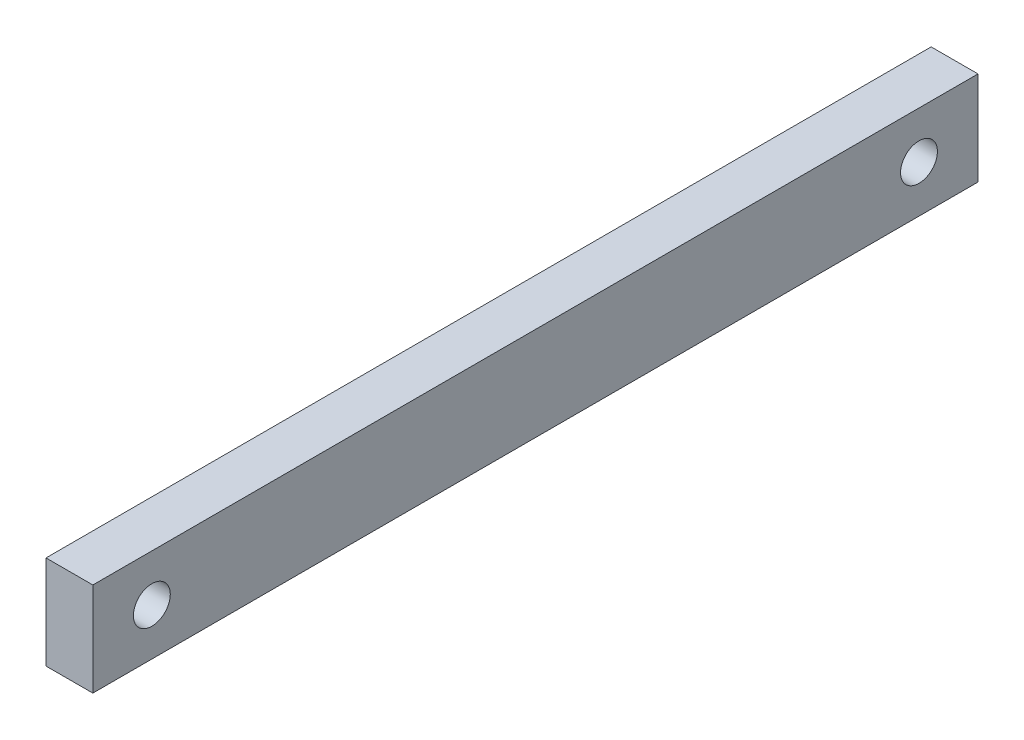
ISO-10303-21;
HEADER;
FILE_DESCRIPTION(('STEP AP214'),'2;1');
FILE_NAME('part.step','',(''),(''),'','','');
FILE_SCHEMA(('AUTOMOTIVE_DESIGN { 1 0 10303 214 1 1 1 1 }'));
ENDSEC;
DATA;
#1=APPLICATION_CONTEXT('core data for automotive mechanical design processes');
#2=APPLICATION_PROTOCOL_DEFINITION('international standard','automotive_design',2000,#1);
#3=PRODUCT_CONTEXT('',#1,'mechanical');
#4=PRODUCT('Part','Part','',(#3));
#5=PRODUCT_RELATED_PRODUCT_CATEGORY('part','',(#4));
#6=PRODUCT_DEFINITION_FORMATION('','',#4);
#7=PRODUCT_DEFINITION_CONTEXT('part definition',#1,'design');
#8=PRODUCT_DEFINITION('design','',#6,#7);
#9=PRODUCT_DEFINITION_SHAPE('','',#8);
#10=(LENGTH_UNIT() NAMED_UNIT(*) SI_UNIT(.MILLI.,.METRE.));
#11=(NAMED_UNIT(*) PLANE_ANGLE_UNIT() SI_UNIT($,.RADIAN.));
#12=(NAMED_UNIT(*) SI_UNIT($,.STERADIAN.) SOLID_ANGLE_UNIT());
#13=UNCERTAINTY_MEASURE_WITH_UNIT(LENGTH_MEASURE(1.E-05),#10,'distance_accuracy_value','');
#14=(GEOMETRIC_REPRESENTATION_CONTEXT(3) GLOBAL_UNCERTAINTY_ASSIGNED_CONTEXT((#13)) GLOBAL_UNIT_ASSIGNED_CONTEXT((#10,
#11,#12)) REPRESENTATION_CONTEXT('',''));
#15=CARTESIAN_POINT('',(0.,0.,0.));
#16=DIRECTION('',(0.,0.,1.));
#17=DIRECTION('',(1.,0.,0.));
#18=AXIS2_PLACEMENT_3D('',#15,#16,#17);
#19=CARTESIAN_POINT('',(3.175,-6.35,-60.));
#20=DIRECTION('',(1.,0.,0.));
#21=DIRECTION('',(0.,0.,-1.));
#22=AXIS2_PLACEMENT_3D('',#19,#20,#21);
#23=PLANE('',#22);
#24=CARTESIAN_POINT('',(3.175,0.,52.));
#25=DIRECTION('',(1.,0.,0.));
#26=DIRECTION('',(0.,0.,-1.));
#27=AXIS2_PLACEMENT_3D('',#24,#25,#26);
#28=CIRCLE('',#27,2.49999999999999);
#29=CARTESIAN_POINT('',(3.175,0.,49.5));
#30=VERTEX_POINT('',#29);
#31=EDGE_CURVE('E105',#30,#30,#28,.T.);
#32=ORIENTED_EDGE('',*,*,#31,.F.);
#33=EDGE_LOOP('',(#32));
#34=FACE_BOUND('',#33,.T.);
#35=CARTESIAN_POINT('',(3.175,0.,-52.));
#36=DIRECTION('',(1.,0.,0.));
#37=DIRECTION('',(0.,0.,1.));
#38=AXIS2_PLACEMENT_3D('',#35,#36,#37);
#39=CIRCLE('',#38,2.49999999999999);
#40=CARTESIAN_POINT('',(3.175,0.,-49.5));
#41=VERTEX_POINT('',#40);
#42=EDGE_CURVE('E108',#41,#41,#39,.T.);
#43=ORIENTED_EDGE('',*,*,#42,.F.);
#44=EDGE_LOOP('',(#43));
#45=FACE_BOUND('',#44,.T.);
#46=DIRECTION('',(0.,0.,1.));
#47=VECTOR('',#46,1.);
#48=CARTESIAN_POINT('',(3.175,6.35,-60.));
#49=LINE('',#48,#47);
#50=CARTESIAN_POINT('',(3.175,6.35,-60.));
#51=VERTEX_POINT('',#50);
#52=CARTESIAN_POINT('',(3.175,6.35,60.));
#53=VERTEX_POINT('',#52);
#54=EDGE_CURVE('E42',#51,#53,#49,.T.);
#55=ORIENTED_EDGE('',*,*,#54,.T.);
#56=DIRECTION('',(0.,1.,0.));
#57=VECTOR('',#56,1.);
#58=CARTESIAN_POINT('',(3.175,-6.35,60.));
#59=LINE('',#58,#57);
#60=CARTESIAN_POINT('',(3.175,-6.35,60.));
#61=VERTEX_POINT('',#60);
#62=EDGE_CURVE('E80',#61,#53,#59,.T.);
#63=ORIENTED_EDGE('',*,*,#62,.F.);
#64=DIRECTION('',(0.,0.,1.));
#65=VECTOR('',#64,1.);
#66=CARTESIAN_POINT('',(3.175,-6.35,-60.));
#67=LINE('',#66,#65);
#68=CARTESIAN_POINT('',(3.175,-6.35,-60.));
#69=VERTEX_POINT('',#68);
#70=EDGE_CURVE('E11',#69,#61,#67,.T.);
#71=ORIENTED_EDGE('',*,*,#70,.F.);
#72=DIRECTION('',(0.,1.,0.));
#73=VECTOR('',#72,1.);
#74=CARTESIAN_POINT('',(3.175,-6.35,-60.));
#75=LINE('',#74,#73);
#76=EDGE_CURVE('E81',#69,#51,#75,.T.);
#77=ORIENTED_EDGE('',*,*,#76,.T.);
#78=EDGE_LOOP('',(#55,#63,#71,#77));
#79=FACE_BOUND('',#78,.T.);
#80=ADVANCED_FACE('F39',(#34,#45,#79),#23,.T.);
#81=CARTESIAN_POINT('',(-3.175,-6.35,-60.));
#82=DIRECTION('',(0.,-1.,0.));
#83=DIRECTION('',(0.,0.,-1.));
#84=AXIS2_PLACEMENT_3D('',#81,#82,#83);
#85=PLANE('',#84);
#86=ORIENTED_EDGE('',*,*,#70,.T.);
#87=DIRECTION('',(1.,0.,0.));
#88=VECTOR('',#87,1.);
#89=CARTESIAN_POINT('',(-3.175,-6.35,60.));
#90=LINE('',#89,#88);
#91=CARTESIAN_POINT('',(-3.175,-6.35,60.));
#92=VERTEX_POINT('',#91);
#93=EDGE_CURVE('E99',#92,#61,#90,.T.);
#94=ORIENTED_EDGE('',*,*,#93,.F.);
#95=DIRECTION('',(0.,0.,1.));
#96=VECTOR('',#95,1.);
#97=CARTESIAN_POINT('',(-3.175,-6.35,-60.));
#98=LINE('',#97,#96);
#99=CARTESIAN_POINT('',(-3.175,-6.35,-60.));
#100=VERTEX_POINT('',#99);
#101=EDGE_CURVE('E48',#100,#92,#98,.T.);
#102=ORIENTED_EDGE('',*,*,#101,.F.);
#103=DIRECTION('',(1.,0.,0.));
#104=VECTOR('',#103,1.);
#105=CARTESIAN_POINT('',(-3.175,-6.35,-60.));
#106=LINE('',#105,#104);
#107=EDGE_CURVE('E87',#100,#69,#106,.T.);
#108=ORIENTED_EDGE('',*,*,#107,.T.);
#109=EDGE_LOOP('',(#86,#94,#102,#108));
#110=FACE_BOUND('',#109,.T.);
#111=ADVANCED_FACE('F131',(#110),#85,.T.);
#112=CARTESIAN_POINT('',(-3.175,-6.35,-60.));
#113=DIRECTION('',(-1.,0.,0.));
#114=DIRECTION('',(0.,0.,1.));
#115=AXIS2_PLACEMENT_3D('',#112,#113,#114);
#116=PLANE('',#115);
#117=CARTESIAN_POINT('',(-3.175,0.,52.));
#118=DIRECTION('',(1.,0.,0.));
#119=DIRECTION('',(0.,0.,-1.));
#120=AXIS2_PLACEMENT_3D('',#117,#118,#119);
#121=CIRCLE('',#120,2.49999999999999);
#122=CARTESIAN_POINT('',(-3.175,0.,49.5));
#123=VERTEX_POINT('',#122);
#124=EDGE_CURVE('E101',#123,#123,#121,.T.);
#125=ORIENTED_EDGE('',*,*,#124,.T.);
#126=EDGE_LOOP('',(#125));
#127=FACE_BOUND('',#126,.T.);
#128=CARTESIAN_POINT('',(-3.175,0.,-52.));
#129=DIRECTION('',(1.,0.,0.));
#130=DIRECTION('',(0.,0.,1.));
#131=AXIS2_PLACEMENT_3D('',#128,#129,#130);
#132=CIRCLE('',#131,2.49999999999999);
#133=CARTESIAN_POINT('',(-3.175,0.,-49.5));
#134=VERTEX_POINT('',#133);
#135=EDGE_CURVE('E155',#134,#134,#132,.T.);
#136=ORIENTED_EDGE('',*,*,#135,.T.);
#137=EDGE_LOOP('',(#136));
#138=FACE_BOUND('',#137,.T.);
#139=ORIENTED_EDGE('',*,*,#101,.T.);
#140=DIRECTION('',(0.,-1.,0.));
#141=VECTOR('',#140,1.);
#142=CARTESIAN_POINT('',(-3.175,-6.35,60.));
#143=LINE('',#142,#141);
#144=CARTESIAN_POINT('',(-3.175,6.35,60.));
#145=VERTEX_POINT('',#144);
#146=EDGE_CURVE('E95',#145,#92,#143,.T.);
#147=ORIENTED_EDGE('',*,*,#146,.F.);
#148=DIRECTION('',(0.,0.,1.));
#149=VECTOR('',#148,1.);
#150=CARTESIAN_POINT('',(-3.175,6.35,-60.));
#151=LINE('',#150,#149);
#152=CARTESIAN_POINT('',(-3.175,6.35,-60.));
#153=VERTEX_POINT('',#152);
#154=EDGE_CURVE('E86',#153,#145,#151,.T.);
#155=ORIENTED_EDGE('',*,*,#154,.F.);
#156=DIRECTION('',(0.,-1.,0.));
#157=VECTOR('',#156,1.);
#158=CARTESIAN_POINT('',(-3.175,-6.35,-60.));
#159=LINE('',#158,#157);
#160=EDGE_CURVE('E120',#153,#100,#159,.T.);
#161=ORIENTED_EDGE('',*,*,#160,.T.);
#162=EDGE_LOOP('',(#139,#147,#155,#161));
#163=FACE_BOUND('',#162,.T.);
#164=ADVANCED_FACE('F128',(#127,#138,#163),#116,.T.);
#165=CARTESIAN_POINT('',(-3.175,6.35,-60.));
#166=DIRECTION('',(0.,1.,0.));
#167=DIRECTION('',(0.,0.,1.));
#168=AXIS2_PLACEMENT_3D('',#165,#166,#167);
#169=PLANE('',#168);
#170=ORIENTED_EDGE('',*,*,#154,.T.);
#171=DIRECTION('',(-1.,0.,0.));
#172=VECTOR('',#171,1.);
#173=CARTESIAN_POINT('',(-3.175,6.35,60.));
#174=LINE('',#173,#172);
#175=EDGE_CURVE('E89',#53,#145,#174,.T.);
#176=ORIENTED_EDGE('',*,*,#175,.F.);
#177=ORIENTED_EDGE('',*,*,#54,.F.);
#178=DIRECTION('',(-1.,0.,0.));
#179=VECTOR('',#178,1.);
#180=CARTESIAN_POINT('',(-3.175,6.35,-60.));
#181=LINE('',#180,#179);
#182=EDGE_CURVE('E117',#51,#153,#181,.T.);
#183=ORIENTED_EDGE('',*,*,#182,.T.);
#184=EDGE_LOOP('',(#170,#176,#177,#183));
#185=FACE_BOUND('',#184,.T.);
#186=ADVANCED_FACE('F90',(#185),#169,.T.);
#187=CARTESIAN_POINT('',(0.,0.,-60.));
#188=DIRECTION('',(0.,0.,-1.));
#189=DIRECTION('',(-1.,0.,0.));
#190=AXIS2_PLACEMENT_3D('',#187,#188,#189);
#191=PLANE('',#190);
#192=ORIENTED_EDGE('',*,*,#76,.F.);
#193=ORIENTED_EDGE('',*,*,#107,.F.);
#194=ORIENTED_EDGE('',*,*,#160,.F.);
#195=ORIENTED_EDGE('',*,*,#182,.F.);
#196=EDGE_LOOP('',(#192,#193,#194,#195));
#197=FACE_BOUND('',#196,.T.);
#198=ADVANCED_FACE('F133',(#197),#191,.T.);
#199=CARTESIAN_POINT('',(0.,0.,60.));
#200=DIRECTION('',(0.,0.,-1.));
#201=DIRECTION('',(-1.,0.,0.));
#202=AXIS2_PLACEMENT_3D('',#199,#200,#201);
#203=PLANE('',#202);
#204=ORIENTED_EDGE('',*,*,#62,.T.);
#205=ORIENTED_EDGE('',*,*,#175,.T.);
#206=ORIENTED_EDGE('',*,*,#146,.T.);
#207=ORIENTED_EDGE('',*,*,#93,.T.);
#208=EDGE_LOOP('',(#204,#205,#206,#207));
#209=FACE_BOUND('',#208,.T.);
#210=ADVANCED_FACE('F98',(#209),#203,.F.);
#211=CARTESIAN_POINT('',(-3.175,0.,-52.));
#212=DIRECTION('',(1.,0.,0.));
#213=DIRECTION('',(0.,0.,-1.));
#214=AXIS2_PLACEMENT_3D('',#211,#212,#213);
#215=CYLINDRICAL_SURFACE('',#214,2.49999999999999);
#216=ORIENTED_EDGE('',*,*,#135,.F.);
#217=EDGE_LOOP('',(#216));
#218=FACE_BOUND('',#217,.T.);
#219=ORIENTED_EDGE('',*,*,#42,.T.);
#220=EDGE_LOOP('',(#219));
#221=FACE_BOUND('',#220,.T.);
#222=ADVANCED_FACE('F140',(#218,#221),#215,.F.);
#223=CARTESIAN_POINT('',(-3.175,0.,52.));
#224=DIRECTION('',(1.,0.,0.));
#225=DIRECTION('',(0.,0.,-1.));
#226=AXIS2_PLACEMENT_3D('',#223,#224,#225);
#227=CYLINDRICAL_SURFACE('',#226,2.49999999999999);
#228=ORIENTED_EDGE('',*,*,#124,.F.);
#229=EDGE_LOOP('',(#228));
#230=FACE_BOUND('',#229,.T.);
#231=ORIENTED_EDGE('',*,*,#31,.T.);
#232=EDGE_LOOP('',(#231));
#233=FACE_BOUND('',#232,.T.);
#234=ADVANCED_FACE('F163',(#230,#233),#227,.F.);
#235=CLOSED_SHELL('',(#80,#111,#164,#186,#198,#210,#222,#234));
#236=MANIFOLD_SOLID_BREP('B2',#235);
#237=ADVANCED_BREP_SHAPE_REPRESENTATION('',(#18,#236),#14);
#238=SHAPE_DEFINITION_REPRESENTATION(#9,#237);
ENDSEC;
END-ISO-10303-21;
